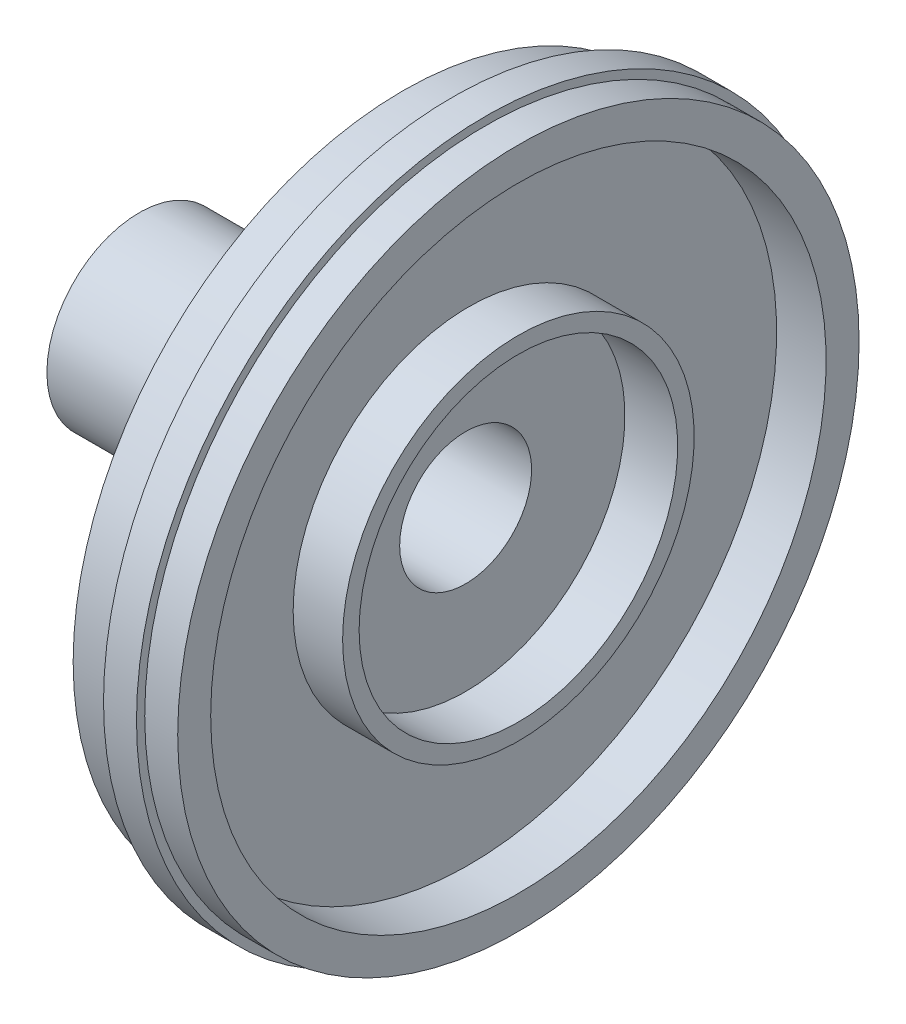
ISO-10303-21;
HEADER;
FILE_DESCRIPTION(('STEP AP214'),'2;1');
FILE_NAME('part.step','',(''),(''),'','','');
FILE_SCHEMA(('AUTOMOTIVE_DESIGN { 1 0 10303 214 1 1 1 1 }'));
ENDSEC;
DATA;
#1=APPLICATION_CONTEXT('core data for automotive mechanical design processes');
#2=APPLICATION_PROTOCOL_DEFINITION('international standard','automotive_design',2000,#1);
#3=PRODUCT_CONTEXT('',#1,'mechanical');
#4=PRODUCT('Part','Part','',(#3));
#5=PRODUCT_RELATED_PRODUCT_CATEGORY('part','',(#4));
#6=PRODUCT_DEFINITION_FORMATION('','',#4);
#7=PRODUCT_DEFINITION_CONTEXT('part definition',#1,'design');
#8=PRODUCT_DEFINITION('design','',#6,#7);
#9=PRODUCT_DEFINITION_SHAPE('','',#8);
#10=(LENGTH_UNIT() NAMED_UNIT(*) SI_UNIT(.MILLI.,.METRE.));
#11=(NAMED_UNIT(*) PLANE_ANGLE_UNIT() SI_UNIT($,.RADIAN.));
#12=(NAMED_UNIT(*) SI_UNIT($,.STERADIAN.) SOLID_ANGLE_UNIT());
#13=UNCERTAINTY_MEASURE_WITH_UNIT(LENGTH_MEASURE(1.E-05),#10,'distance_accuracy_value','');
#14=(GEOMETRIC_REPRESENTATION_CONTEXT(3) GLOBAL_UNCERTAINTY_ASSIGNED_CONTEXT((#13)) GLOBAL_UNIT_ASSIGNED_CONTEXT((#10,
#11,#12)) REPRESENTATION_CONTEXT('',''));
#15=CARTESIAN_POINT('',(0.,0.,0.));
#16=DIRECTION('',(0.,0.,1.));
#17=DIRECTION('',(1.,0.,0.));
#18=AXIS2_PLACEMENT_3D('',#15,#16,#17);
#19=CARTESIAN_POINT('',(0.,0.,0.));
#20=DIRECTION('',(-1.,0.,0.));
#21=DIRECTION('',(0.,0.,1.));
#22=AXIS2_PLACEMENT_3D('',#19,#20,#21);
#23=CYLINDRICAL_SURFACE('',#22,15.33525);
#24=CARTESIAN_POINT('',(36.4998,0.,0.));
#25=DIRECTION('',(-1.,0.,0.));
#26=DIRECTION('',(0.,0.,1.));
#27=AXIS2_PLACEMENT_3D('',#24,#25,#26);
#28=CIRCLE('',#27,15.33525);
#29=CARTESIAN_POINT('',(36.4998,0.,15.33525));
#30=VERTEX_POINT('',#29);
#31=EDGE_CURVE('E10',#30,#30,#28,.T.);
#32=ORIENTED_EDGE('',*,*,#31,.F.);
#33=EDGE_LOOP('',(#32));
#34=FACE_BOUND('',#33,.T.);
#35=CARTESIAN_POINT('',(31.4198,0.,0.));
#36=DIRECTION('',(-1.,0.,0.));
#37=DIRECTION('',(0.,0.,1.));
#38=AXIS2_PLACEMENT_3D('',#35,#36,#37);
#39=CIRCLE('',#38,15.33525);
#40=CARTESIAN_POINT('',(31.4198,0.,15.33525));
#41=VERTEX_POINT('',#40);
#42=EDGE_CURVE('E101',#41,#41,#39,.T.);
#43=ORIENTED_EDGE('',*,*,#42,.T.);
#44=EDGE_LOOP('',(#43));
#45=FACE_BOUND('',#44,.T.);
#46=ADVANCED_FACE('F31',(#34,#45),#23,.F.);
#47=CARTESIAN_POINT('',(36.4998,15.33525,0.));
#48=DIRECTION('',(-1.,0.,0.));
#49=DIRECTION('',(0.,0.,1.));
#50=AXIS2_PLACEMENT_3D('',#47,#48,#49);
#51=PLANE('',#50);
#52=CARTESIAN_POINT('',(36.4998,0.,0.));
#53=DIRECTION('',(-1.,0.,0.));
#54=DIRECTION('',(0.,0.,1.));
#55=AXIS2_PLACEMENT_3D('',#52,#53,#54);
#56=CIRCLE('',#55,16.92275);
#57=CARTESIAN_POINT('',(36.4998,0.,16.92275));
#58=VERTEX_POINT('',#57);
#59=EDGE_CURVE('E37',#58,#58,#56,.T.);
#60=ORIENTED_EDGE('',*,*,#59,.F.);
#61=EDGE_LOOP('',(#60));
#62=FACE_BOUND('',#61,.T.);
#63=ORIENTED_EDGE('',*,*,#31,.T.);
#64=EDGE_LOOP('',(#63));
#65=FACE_BOUND('',#64,.T.);
#66=ADVANCED_FACE('F222',(#62,#65),#51,.F.);
#67=CARTESIAN_POINT('',(0.,0.,0.));
#68=DIRECTION('',(-1.,0.,0.));
#69=DIRECTION('',(0.,0.,1.));
#70=AXIS2_PLACEMENT_3D('',#67,#68,#69);
#71=CYLINDRICAL_SURFACE('',#70,16.92275);
#72=CARTESIAN_POINT('',(31.7373,0.,0.));
#73=DIRECTION('',(-1.,0.,0.));
#74=DIRECTION('',(0.,0.,1.));
#75=AXIS2_PLACEMENT_3D('',#72,#73,#74);
#76=CIRCLE('',#75,16.92275);
#77=CARTESIAN_POINT('',(31.7373,0.,16.92275));
#78=VERTEX_POINT('',#77);
#79=EDGE_CURVE('E41',#78,#78,#76,.T.);
#80=ORIENTED_EDGE('',*,*,#79,.F.);
#81=EDGE_LOOP('',(#80));
#82=FACE_BOUND('',#81,.T.);
#83=ORIENTED_EDGE('',*,*,#59,.T.);
#84=EDGE_LOOP('',(#83));
#85=FACE_BOUND('',#84,.T.);
#86=ADVANCED_FACE('F217',(#82,#85),#71,.T.);
#87=CARTESIAN_POINT('',(31.7373,16.92275,0.));
#88=DIRECTION('',(-1.,0.,0.));
#89=DIRECTION('',(0.,0.,1.));
#90=AXIS2_PLACEMENT_3D('',#87,#88,#89);
#91=PLANE('',#90);
#92=CARTESIAN_POINT('',(31.7373,0.,0.));
#93=DIRECTION('',(-1.,0.,0.));
#94=DIRECTION('',(0.,0.,1.));
#95=AXIS2_PLACEMENT_3D('',#92,#93,#94);
#96=CIRCLE('',#95,29.62275);
#97=CARTESIAN_POINT('',(31.7373,0.,29.62275));
#98=VERTEX_POINT('',#97);
#99=EDGE_CURVE('E45',#98,#98,#96,.T.);
#100=ORIENTED_EDGE('',*,*,#99,.F.);
#101=EDGE_LOOP('',(#100));
#102=FACE_BOUND('',#101,.T.);
#103=ORIENTED_EDGE('',*,*,#79,.T.);
#104=EDGE_LOOP('',(#103));
#105=FACE_BOUND('',#104,.T.);
#106=ADVANCED_FACE('F211',(#102,#105),#91,.F.);
#107=CARTESIAN_POINT('',(0.,0.,0.));
#108=DIRECTION('',(-1.,0.,0.));
#109=DIRECTION('',(0.,0.,1.));
#110=AXIS2_PLACEMENT_3D('',#107,#108,#109);
#111=CYLINDRICAL_SURFACE('',#110,29.62275);
#112=CARTESIAN_POINT('',(36.4998,0.,0.));
#113=DIRECTION('',(-1.,0.,0.));
#114=DIRECTION('',(0.,0.,1.));
#115=AXIS2_PLACEMENT_3D('',#112,#113,#114);
#116=CIRCLE('',#115,29.62275);
#117=CARTESIAN_POINT('',(36.4998,0.,29.62275));
#118=VERTEX_POINT('',#117);
#119=EDGE_CURVE('E50',#118,#118,#116,.T.);
#120=ORIENTED_EDGE('',*,*,#119,.F.);
#121=EDGE_LOOP('',(#120));
#122=FACE_BOUND('',#121,.T.);
#123=ORIENTED_EDGE('',*,*,#99,.T.);
#124=EDGE_LOOP('',(#123));
#125=FACE_BOUND('',#124,.T.);
#126=ADVANCED_FACE('F205',(#122,#125),#111,.F.);
#127=CARTESIAN_POINT('',(36.4998,29.62275,0.));
#128=DIRECTION('',(-1.,0.,0.));
#129=DIRECTION('',(0.,0.,1.));
#130=AXIS2_PLACEMENT_3D('',#127,#128,#129);
#131=PLANE('',#130);
#132=CARTESIAN_POINT('',(36.4998,0.,0.));
#133=DIRECTION('',(-1.,0.,0.));
#134=DIRECTION('',(0.,0.,1.));
#135=AXIS2_PLACEMENT_3D('',#132,#133,#134);
#136=CIRCLE('',#135,32.79775);
#137=CARTESIAN_POINT('',(36.4998,0.,32.79775));
#138=VERTEX_POINT('',#137);
#139=EDGE_CURVE('E53',#138,#138,#136,.T.);
#140=ORIENTED_EDGE('',*,*,#139,.F.);
#141=EDGE_LOOP('',(#140));
#142=FACE_BOUND('',#141,.T.);
#143=ORIENTED_EDGE('',*,*,#119,.T.);
#144=EDGE_LOOP('',(#143));
#145=FACE_BOUND('',#144,.T.);
#146=ADVANCED_FACE('F199',(#142,#145),#131,.F.);
#147=CARTESIAN_POINT('',(0.,0.,0.));
#148=DIRECTION('',(-1.,0.,0.));
#149=DIRECTION('',(0.,0.,1.));
#150=AXIS2_PLACEMENT_3D('',#147,#148,#149);
#151=CYLINDRICAL_SURFACE('',#150,32.79775);
#152=CARTESIAN_POINT('',(33.3248,0.,0.));
#153=DIRECTION('',(-1.,0.,0.));
#154=DIRECTION('',(0.,0.,1.));
#155=AXIS2_PLACEMENT_3D('',#152,#153,#154);
#156=CIRCLE('',#155,32.79775);
#157=CARTESIAN_POINT('',(33.3248,0.,32.79775));
#158=VERTEX_POINT('',#157);
#159=EDGE_CURVE('E56',#158,#158,#156,.T.);
#160=ORIENTED_EDGE('',*,*,#159,.F.);
#161=EDGE_LOOP('',(#160));
#162=FACE_BOUND('',#161,.T.);
#163=ORIENTED_EDGE('',*,*,#139,.T.);
#164=EDGE_LOOP('',(#163));
#165=FACE_BOUND('',#164,.T.);
#166=ADVANCED_FACE('F193',(#162,#165),#151,.T.);
#167=CARTESIAN_POINT('',(33.3248,32.79775,0.));
#168=DIRECTION('',(-1.,0.,0.));
#169=DIRECTION('',(0.,0.,1.));
#170=AXIS2_PLACEMENT_3D('',#167,#168,#169);
#171=PLANE('',#170);
#172=CARTESIAN_POINT('',(33.3248,0.,0.));
#173=DIRECTION('',(-1.,0.,0.));
#174=DIRECTION('',(0.,0.,1.));
#175=AXIS2_PLACEMENT_3D('',#172,#173,#174);
#176=CIRCLE('',#175,33.5915);
#177=CARTESIAN_POINT('',(33.3248,0.,33.5915));
#178=VERTEX_POINT('',#177);
#179=EDGE_CURVE('E59',#178,#178,#176,.T.);
#180=ORIENTED_EDGE('',*,*,#179,.F.);
#181=EDGE_LOOP('',(#180));
#182=FACE_BOUND('',#181,.T.);
#183=ORIENTED_EDGE('',*,*,#159,.T.);
#184=EDGE_LOOP('',(#183));
#185=FACE_BOUND('',#184,.T.);
#186=ADVANCED_FACE('F187',(#182,#185),#171,.F.);
#187=CARTESIAN_POINT('',(0.,0.,0.));
#188=DIRECTION('',(-1.,0.,0.));
#189=DIRECTION('',(0.,0.,1.));
#190=AXIS2_PLACEMENT_3D('',#187,#188,#189);
#191=CYLINDRICAL_SURFACE('',#190,33.5915);
#192=CARTESIAN_POINT('',(30.1498,0.,0.));
#193=DIRECTION('',(-1.,0.,0.));
#194=DIRECTION('',(0.,0.,1.));
#195=AXIS2_PLACEMENT_3D('',#192,#193,#194);
#196=CIRCLE('',#195,33.5915);
#197=CARTESIAN_POINT('',(30.1498,0.,33.5915));
#198=VERTEX_POINT('',#197);
#199=EDGE_CURVE('E62',#198,#198,#196,.T.);
#200=ORIENTED_EDGE('',*,*,#199,.F.);
#201=EDGE_LOOP('',(#200));
#202=FACE_BOUND('',#201,.T.);
#203=ORIENTED_EDGE('',*,*,#179,.T.);
#204=EDGE_LOOP('',(#203));
#205=FACE_BOUND('',#204,.T.);
#206=ADVANCED_FACE('F181',(#202,#205),#191,.T.);
#207=CARTESIAN_POINT('',(30.1498,33.5915,0.));
#208=DIRECTION('',(1.,0.,0.));
#209=DIRECTION('',(0.,0.,-1.));
#210=AXIS2_PLACEMENT_3D('',#207,#208,#209);
#211=PLANE('',#210);
#212=CARTESIAN_POINT('',(30.1498,0.,0.));
#213=DIRECTION('',(-1.,0.,0.));
#214=DIRECTION('',(0.,0.,1.));
#215=AXIS2_PLACEMENT_3D('',#212,#213,#214);
#216=CIRCLE('',#215,31.75);
#217=CARTESIAN_POINT('',(30.1498,0.,31.75));
#218=VERTEX_POINT('',#217);
#219=EDGE_CURVE('E65',#218,#218,#216,.T.);
#220=ORIENTED_EDGE('',*,*,#219,.F.);
#221=EDGE_LOOP('',(#220));
#222=FACE_BOUND('',#221,.T.);
#223=ORIENTED_EDGE('',*,*,#199,.T.);
#224=EDGE_LOOP('',(#223));
#225=FACE_BOUND('',#224,.T.);
#226=ADVANCED_FACE('F175',(#222,#225),#211,.F.);
#227=CARTESIAN_POINT('',(0.,0.,0.));
#228=DIRECTION('',(-1.,0.,0.));
#229=DIRECTION('',(0.,0.,1.));
#230=AXIS2_PLACEMENT_3D('',#227,#228,#229);
#231=CYLINDRICAL_SURFACE('',#230,31.75);
#232=CARTESIAN_POINT('',(25.3873,0.,0.));
#233=DIRECTION('',(-1.,0.,0.));
#234=DIRECTION('',(0.,0.,1.));
#235=AXIS2_PLACEMENT_3D('',#232,#233,#234);
#236=CIRCLE('',#235,31.75);
#237=CARTESIAN_POINT('',(25.3873,0.,31.75));
#238=VERTEX_POINT('',#237);
#239=EDGE_CURVE('E68',#238,#238,#236,.T.);
#240=ORIENTED_EDGE('',*,*,#239,.F.);
#241=EDGE_LOOP('',(#240));
#242=FACE_BOUND('',#241,.T.);
#243=ORIENTED_EDGE('',*,*,#219,.T.);
#244=EDGE_LOOP('',(#243));
#245=FACE_BOUND('',#244,.T.);
#246=ADVANCED_FACE('F169',(#242,#245),#231,.T.);
#247=CARTESIAN_POINT('',(25.3873,31.75,0.));
#248=DIRECTION('',(1.,0.,0.));
#249=DIRECTION('',(0.,0.,-1.));
#250=AXIS2_PLACEMENT_3D('',#247,#248,#249);
#251=PLANE('',#250);
#252=CARTESIAN_POINT('',(25.3873,0.,0.));
#253=DIRECTION('',(-1.,0.,0.));
#254=DIRECTION('',(0.,0.,1.));
#255=AXIS2_PLACEMENT_3D('',#252,#253,#254);
#256=CIRCLE('',#255,28.575);
#257=CARTESIAN_POINT('',(25.3873,0.,28.575));
#258=VERTEX_POINT('',#257);
#259=EDGE_CURVE('E71',#258,#258,#256,.T.);
#260=ORIENTED_EDGE('',*,*,#259,.F.);
#261=EDGE_LOOP('',(#260));
#262=FACE_BOUND('',#261,.T.);
#263=ORIENTED_EDGE('',*,*,#239,.T.);
#264=EDGE_LOOP('',(#263));
#265=FACE_BOUND('',#264,.T.);
#266=ADVANCED_FACE('F163',(#262,#265),#251,.F.);
#267=CARTESIAN_POINT('',(0.,0.,0.));
#268=DIRECTION('',(-1.,0.,0.));
#269=DIRECTION('',(0.,0.,1.));
#270=AXIS2_PLACEMENT_3D('',#267,#268,#269);
#271=CYLINDRICAL_SURFACE('',#270,28.575);
#272=CARTESIAN_POINT('',(30.1498,0.,0.));
#273=DIRECTION('',(-1.,0.,0.));
#274=DIRECTION('',(0.,0.,1.));
#275=AXIS2_PLACEMENT_3D('',#272,#273,#274);
#276=CIRCLE('',#275,28.575);
#277=CARTESIAN_POINT('',(30.1498,0.,28.575));
#278=VERTEX_POINT('',#277);
#279=EDGE_CURVE('E74',#278,#278,#276,.T.);
#280=ORIENTED_EDGE('',*,*,#279,.F.);
#281=EDGE_LOOP('',(#280));
#282=FACE_BOUND('',#281,.T.);
#283=ORIENTED_EDGE('',*,*,#259,.T.);
#284=EDGE_LOOP('',(#283));
#285=FACE_BOUND('',#284,.T.);
#286=ADVANCED_FACE('F157',(#282,#285),#271,.F.);
#287=CARTESIAN_POINT('',(30.1498,28.575,0.));
#288=DIRECTION('',(1.,0.,0.));
#289=DIRECTION('',(0.,0.,-1.));
#290=AXIS2_PLACEMENT_3D('',#287,#288,#289);
#291=PLANE('',#290);
#292=CARTESIAN_POINT('',(30.1498,0.,0.));
#293=DIRECTION('',(-1.,0.,0.));
#294=DIRECTION('',(0.,0.,1.));
#295=AXIS2_PLACEMENT_3D('',#292,#293,#294);
#296=CIRCLE('',#295,19.05);
#297=CARTESIAN_POINT('',(30.1498,0.,19.05));
#298=VERTEX_POINT('',#297);
#299=EDGE_CURVE('E77',#298,#298,#296,.T.);
#300=ORIENTED_EDGE('',*,*,#299,.F.);
#301=EDGE_LOOP('',(#300));
#302=FACE_BOUND('',#301,.T.);
#303=ORIENTED_EDGE('',*,*,#279,.T.);
#304=EDGE_LOOP('',(#303));
#305=FACE_BOUND('',#304,.T.);
#306=ADVANCED_FACE('F151',(#302,#305),#291,.F.);
#307=CARTESIAN_POINT('',(0.,0.,0.));
#308=DIRECTION('',(-1.,0.,0.));
#309=DIRECTION('',(0.,0.,1.));
#310=AXIS2_PLACEMENT_3D('',#307,#308,#309);
#311=CYLINDRICAL_SURFACE('',#310,19.05);
#312=CARTESIAN_POINT('',(26.9748,0.,0.));
#313=DIRECTION('',(-1.,0.,0.));
#314=DIRECTION('',(0.,0.,1.));
#315=AXIS2_PLACEMENT_3D('',#312,#313,#314);
#316=CIRCLE('',#315,19.05);
#317=CARTESIAN_POINT('',(26.9748,0.,19.05));
#318=VERTEX_POINT('',#317);
#319=EDGE_CURVE('E80',#318,#318,#316,.T.);
#320=ORIENTED_EDGE('',*,*,#319,.F.);
#321=EDGE_LOOP('',(#320));
#322=FACE_BOUND('',#321,.T.);
#323=ORIENTED_EDGE('',*,*,#299,.T.);
#324=EDGE_LOOP('',(#323));
#325=FACE_BOUND('',#324,.T.);
#326=ADVANCED_FACE('F145',(#322,#325),#311,.T.);
#327=CARTESIAN_POINT('',(26.9748,19.05,0.));
#328=DIRECTION('',(1.,0.,0.));
#329=DIRECTION('',(0.,0.,-1.));
#330=AXIS2_PLACEMENT_3D('',#327,#328,#329);
#331=PLANE('',#330);
#332=CARTESIAN_POINT('',(26.9748,0.,0.));
#333=DIRECTION('',(-1.,0.,0.));
#334=DIRECTION('',(0.,0.,1.));
#335=AXIS2_PLACEMENT_3D('',#332,#333,#334);
#336=CIRCLE('',#335,9.525);
#337=CARTESIAN_POINT('',(26.9748,0.,9.525));
#338=VERTEX_POINT('',#337);
#339=EDGE_CURVE('E83',#338,#338,#336,.T.);
#340=ORIENTED_EDGE('',*,*,#339,.F.);
#341=EDGE_LOOP('',(#340));
#342=FACE_BOUND('',#341,.T.);
#343=ORIENTED_EDGE('',*,*,#319,.T.);
#344=EDGE_LOOP('',(#343));
#345=FACE_BOUND('',#344,.T.);
#346=ADVANCED_FACE('F139',(#342,#345),#331,.F.);
#347=CARTESIAN_POINT('',(0.,0.,0.));
#348=DIRECTION('',(-1.,0.,0.));
#349=DIRECTION('',(0.,0.,1.));
#350=AXIS2_PLACEMENT_3D('',#347,#348,#349);
#351=CYLINDRICAL_SURFACE('',#350,9.525);
#352=CARTESIAN_POINT('',(19.05,0.,0.));
#353=DIRECTION('',(-1.,0.,0.));
#354=DIRECTION('',(0.,0.,1.));
#355=AXIS2_PLACEMENT_3D('',#352,#353,#354);
#356=CIRCLE('',#355,9.525);
#357=CARTESIAN_POINT('',(19.05,0.,9.525));
#358=VERTEX_POINT('',#357);
#359=EDGE_CURVE('E86',#358,#358,#356,.T.);
#360=ORIENTED_EDGE('',*,*,#359,.F.);
#361=EDGE_LOOP('',(#360));
#362=FACE_BOUND('',#361,.T.);
#363=ORIENTED_EDGE('',*,*,#339,.T.);
#364=EDGE_LOOP('',(#363));
#365=FACE_BOUND('',#364,.T.);
#366=ADVANCED_FACE('F133',(#362,#365),#351,.T.);
#367=CARTESIAN_POINT('',(19.05,9.525,0.));
#368=DIRECTION('',(1.,0.,0.));
#369=DIRECTION('',(0.,0.,-1.));
#370=AXIS2_PLACEMENT_3D('',#367,#368,#369);
#371=PLANE('',#370);
#372=CARTESIAN_POINT('',(19.05,0.,0.));
#373=DIRECTION('',(-1.,0.,0.));
#374=DIRECTION('',(0.,0.,1.));
#375=AXIS2_PLACEMENT_3D('',#372,#373,#374);
#376=CIRCLE('',#375,8.89);
#377=CARTESIAN_POINT('',(19.05,0.,8.89));
#378=VERTEX_POINT('',#377);
#379=EDGE_CURVE('E89',#378,#378,#376,.T.);
#380=ORIENTED_EDGE('',*,*,#379,.F.);
#381=EDGE_LOOP('',(#380));
#382=FACE_BOUND('',#381,.T.);
#383=ORIENTED_EDGE('',*,*,#359,.T.);
#384=EDGE_LOOP('',(#383));
#385=FACE_BOUND('',#384,.T.);
#386=ADVANCED_FACE('F127',(#382,#385),#371,.F.);
#387=CARTESIAN_POINT('',(0.,0.,0.));
#388=DIRECTION('',(-1.,0.,0.));
#389=DIRECTION('',(0.,0.,1.));
#390=AXIS2_PLACEMENT_3D('',#387,#388,#389);
#391=CYLINDRICAL_SURFACE('',#390,8.89);
#392=CARTESIAN_POINT('',(0.,0.,0.));
#393=DIRECTION('',(-1.,0.,0.));
#394=DIRECTION('',(0.,0.,1.));
#395=AXIS2_PLACEMENT_3D('',#392,#393,#394);
#396=CIRCLE('',#395,8.89);
#397=CARTESIAN_POINT('',(0.,0.,8.89));
#398=VERTEX_POINT('',#397);
#399=EDGE_CURVE('E92',#398,#398,#396,.T.);
#400=ORIENTED_EDGE('',*,*,#399,.F.);
#401=EDGE_LOOP('',(#400));
#402=FACE_BOUND('',#401,.T.);
#403=ORIENTED_EDGE('',*,*,#379,.T.);
#404=EDGE_LOOP('',(#403));
#405=FACE_BOUND('',#404,.T.);
#406=ADVANCED_FACE('F121',(#402,#405),#391,.T.);
#407=CARTESIAN_POINT('',(0.,8.89,0.));
#408=DIRECTION('',(1.,0.,0.));
#409=DIRECTION('',(0.,0.,-1.));
#410=AXIS2_PLACEMENT_3D('',#407,#408,#409);
#411=PLANE('',#410);
#412=CARTESIAN_POINT('',(0.,0.,0.));
#413=DIRECTION('',(-1.,0.,0.));
#414=DIRECTION('',(0.,0.,1.));
#415=AXIS2_PLACEMENT_3D('',#412,#413,#414);
#416=CIRCLE('',#415,6.35);
#417=CARTESIAN_POINT('',(0.,0.,6.35));
#418=VERTEX_POINT('',#417);
#419=EDGE_CURVE('E95',#418,#418,#416,.T.);
#420=ORIENTED_EDGE('',*,*,#419,.F.);
#421=EDGE_LOOP('',(#420));
#422=FACE_BOUND('',#421,.T.);
#423=ORIENTED_EDGE('',*,*,#399,.T.);
#424=EDGE_LOOP('',(#423));
#425=FACE_BOUND('',#424,.T.);
#426=ADVANCED_FACE('F115',(#422,#425),#411,.F.);
#427=CARTESIAN_POINT('',(0.,0.,0.));
#428=DIRECTION('',(-1.,0.,0.));
#429=DIRECTION('',(0.,0.,1.));
#430=AXIS2_PLACEMENT_3D('',#427,#428,#429);
#431=CYLINDRICAL_SURFACE('',#430,6.35);
#432=CARTESIAN_POINT('',(31.4198,0.,0.));
#433=DIRECTION('',(-1.,0.,0.));
#434=DIRECTION('',(0.,0.,1.));
#435=AXIS2_PLACEMENT_3D('',#432,#433,#434);
#436=CIRCLE('',#435,6.35);
#437=CARTESIAN_POINT('',(31.4198,0.,6.35));
#438=VERTEX_POINT('',#437);
#439=EDGE_CURVE('E98',#438,#438,#436,.T.);
#440=ORIENTED_EDGE('',*,*,#439,.F.);
#441=EDGE_LOOP('',(#440));
#442=FACE_BOUND('',#441,.T.);
#443=ORIENTED_EDGE('',*,*,#419,.T.);
#444=EDGE_LOOP('',(#443));
#445=FACE_BOUND('',#444,.T.);
#446=ADVANCED_FACE('F109',(#442,#445),#431,.F.);
#447=CARTESIAN_POINT('',(31.4198,6.35,0.));
#448=DIRECTION('',(-1.,0.,0.));
#449=DIRECTION('',(0.,0.,1.));
#450=AXIS2_PLACEMENT_3D('',#447,#448,#449);
#451=PLANE('',#450);
#452=ORIENTED_EDGE('',*,*,#42,.F.);
#453=EDGE_LOOP('',(#452));
#454=FACE_BOUND('',#453,.T.);
#455=ORIENTED_EDGE('',*,*,#439,.T.);
#456=EDGE_LOOP('',(#455));
#457=FACE_BOUND('',#456,.T.);
#458=ADVANCED_FACE('F106',(#454,#457),#451,.F.);
#459=CLOSED_SHELL('',(#46,#66,#86,#106,#126,#146,#166,#186,#206,#226,#246,#266,#286,#306,#326,
#346,#366,#386,#406,#426,#446,#458));
#460=MANIFOLD_SOLID_BREP('B2',#459);
#461=ADVANCED_BREP_SHAPE_REPRESENTATION('',(#18,#460),#14);
#462=SHAPE_DEFINITION_REPRESENTATION(#9,#461);
ENDSEC;
END-ISO-10303-21;
